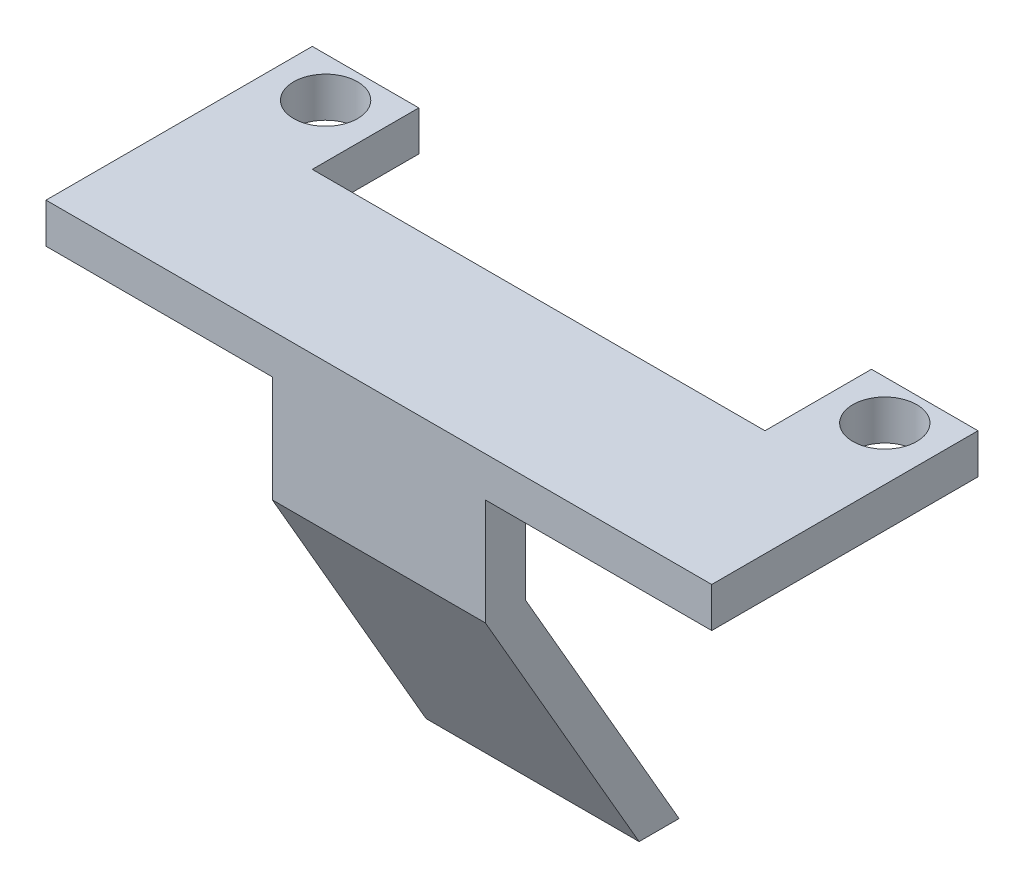
ISO-10303-21;
HEADER;
FILE_DESCRIPTION(('STEP AP214'),'2;1');
FILE_NAME('part.step','',(''),(''),'','','');
FILE_SCHEMA(('AUTOMOTIVE_DESIGN { 1 0 10303 214 1 1 1 1 }'));
ENDSEC;
DATA;
#1=APPLICATION_CONTEXT('core data for automotive mechanical design processes');
#2=APPLICATION_PROTOCOL_DEFINITION('international standard','automotive_design',2000,#1);
#3=PRODUCT_CONTEXT('',#1,'mechanical');
#4=PRODUCT('Part','Part','',(#3));
#5=PRODUCT_RELATED_PRODUCT_CATEGORY('part','',(#4));
#6=PRODUCT_DEFINITION_FORMATION('','',#4);
#7=PRODUCT_DEFINITION_CONTEXT('part definition',#1,'design');
#8=PRODUCT_DEFINITION('design','',#6,#7);
#9=PRODUCT_DEFINITION_SHAPE('','',#8);
#10=(LENGTH_UNIT() NAMED_UNIT(*) SI_UNIT(.MILLI.,.METRE.));
#11=(NAMED_UNIT(*) PLANE_ANGLE_UNIT() SI_UNIT($,.RADIAN.));
#12=(NAMED_UNIT(*) SI_UNIT($,.STERADIAN.) SOLID_ANGLE_UNIT());
#13=UNCERTAINTY_MEASURE_WITH_UNIT(LENGTH_MEASURE(1.E-05),#10,'distance_accuracy_value','');
#14=(GEOMETRIC_REPRESENTATION_CONTEXT(3) GLOBAL_UNCERTAINTY_ASSIGNED_CONTEXT((#13)) GLOBAL_UNIT_ASSIGNED_CONTEXT((#10,
#11,#12)) REPRESENTATION_CONTEXT('',''));
#15=CARTESIAN_POINT('',(0.,0.,0.));
#16=DIRECTION('',(0.,0.,1.));
#17=DIRECTION('',(1.,0.,0.));
#18=AXIS2_PLACEMENT_3D('',#15,#16,#17);
#19=CARTESIAN_POINT('',(0.,1.5,0.));
#20=DIRECTION('',(0.,-1.,0.));
#21=DIRECTION('',(0.,0.,-1.));
#22=AXIS2_PLACEMENT_3D('',#19,#20,#21);
#23=PLANE('',#22);
#24=DIRECTION('',(-1.,0.,0.));
#25=VECTOR('',#24,1.);
#26=CARTESIAN_POINT('',(-12.5,1.5,0.));
#27=LINE('',#26,#25);
#28=CARTESIAN_POINT('',(-8.5,1.5,0.));
#29=VERTEX_POINT('',#28);
#30=CARTESIAN_POINT('',(-12.5,1.5,0.));
#31=VERTEX_POINT('',#30);
#32=EDGE_CURVE('E227',#29,#31,#27,.T.);
#33=ORIENTED_EDGE('',*,*,#32,.T.);
#34=DIRECTION('',(0.,0.,1.));
#35=VECTOR('',#34,1.);
#36=CARTESIAN_POINT('',(-12.5,1.5,10.));
#37=LINE('',#36,#35);
#38=CARTESIAN_POINT('',(-12.5,1.5,10.));
#39=VERTEX_POINT('',#38);
#40=EDGE_CURVE('E231',#31,#39,#37,.T.);
#41=ORIENTED_EDGE('',*,*,#40,.T.);
#42=DIRECTION('',(1.,0.,0.));
#43=VECTOR('',#42,1.);
#44=CARTESIAN_POINT('',(12.5,1.5,10.));
#45=LINE('',#44,#43);
#46=CARTESIAN_POINT('',(12.5,1.5,10.));
#47=VERTEX_POINT('',#46);
#48=EDGE_CURVE('E235',#39,#47,#45,.T.);
#49=ORIENTED_EDGE('',*,*,#48,.T.);
#50=DIRECTION('',(0.,0.,-1.));
#51=VECTOR('',#50,1.);
#52=CARTESIAN_POINT('',(12.5,1.5,0.));
#53=LINE('',#52,#51);
#54=CARTESIAN_POINT('',(12.5,1.5,0.));
#55=VERTEX_POINT('',#54);
#56=EDGE_CURVE('E238',#47,#55,#53,.T.);
#57=ORIENTED_EDGE('',*,*,#56,.T.);
#58=DIRECTION('',(-1.,0.,0.));
#59=VECTOR('',#58,1.);
#60=CARTESIAN_POINT('',(8.5,1.5,0.));
#61=LINE('',#60,#59);
#62=CARTESIAN_POINT('',(8.5,1.5,0.));
#63=VERTEX_POINT('',#62);
#64=EDGE_CURVE('E241',#55,#63,#61,.T.);
#65=ORIENTED_EDGE('',*,*,#64,.T.);
#66=DIRECTION('',(0.,0.,1.));
#67=VECTOR('',#66,1.);
#68=CARTESIAN_POINT('',(8.5,1.5,4.));
#69=LINE('',#68,#67);
#70=CARTESIAN_POINT('',(8.5,1.5,4.));
#71=VERTEX_POINT('',#70);
#72=EDGE_CURVE('E244',#63,#71,#69,.T.);
#73=ORIENTED_EDGE('',*,*,#72,.T.);
#74=DIRECTION('',(-1.,0.,0.));
#75=VECTOR('',#74,1.);
#76=CARTESIAN_POINT('',(-8.5,1.5,4.));
#77=LINE('',#76,#75);
#78=CARTESIAN_POINT('',(-8.5,1.5,4.));
#79=VERTEX_POINT('',#78);
#80=EDGE_CURVE('E247',#71,#79,#77,.T.);
#81=ORIENTED_EDGE('',*,*,#80,.T.);
#82=DIRECTION('',(0.,0.,-1.));
#83=VECTOR('',#82,1.);
#84=CARTESIAN_POINT('',(-8.5,1.5,0.));
#85=LINE('',#84,#83);
#86=EDGE_CURVE('E250',#79,#29,#85,.T.);
#87=ORIENTED_EDGE('',*,*,#86,.T.);
#88=EDGE_LOOP('',(#33,#41,#49,#57,#65,#73,#81,#87));
#89=FACE_BOUND('',#88,.T.);
#90=CARTESIAN_POINT('',(-10.5,1.5,1.5));
#91=DIRECTION('',(0.,1.,0.));
#92=DIRECTION('',(0.,0.,1.));
#93=AXIS2_PLACEMENT_3D('',#90,#91,#92);
#94=CIRCLE('',#93,1.2);
#95=CARTESIAN_POINT('',(-10.5,1.5,2.7));
#96=VERTEX_POINT('',#95);
#97=EDGE_CURVE('E219',#96,#96,#94,.T.);
#98=ORIENTED_EDGE('',*,*,#97,.F.);
#99=EDGE_LOOP('',(#98));
#100=FACE_BOUND('',#99,.T.);
#101=CARTESIAN_POINT('',(10.5,1.5,1.5));
#102=DIRECTION('',(0.,1.,0.));
#103=DIRECTION('',(0.,0.,1.));
#104=AXIS2_PLACEMENT_3D('',#101,#102,#103);
#105=CIRCLE('',#104,1.2);
#106=CARTESIAN_POINT('',(10.5,1.5,2.7));
#107=VERTEX_POINT('',#106);
#108=EDGE_CURVE('E211',#107,#107,#105,.T.);
#109=ORIENTED_EDGE('',*,*,#108,.F.);
#110=EDGE_LOOP('',(#109));
#111=FACE_BOUND('',#110,.T.);
#112=ADVANCED_FACE('F39',(#89,#100,#111),#23,.F.);
#113=CARTESIAN_POINT('',(0.,0.,0.));
#114=DIRECTION('',(0.,-1.,0.));
#115=DIRECTION('',(0.,0.,-1.));
#116=AXIS2_PLACEMENT_3D('',#113,#114,#115);
#117=PLANE('',#116);
#118=DIRECTION('',(0.,0.,-1.));
#119=VECTOR('',#118,1.);
#120=CARTESIAN_POINT('',(-4.,0.,10.));
#121=LINE('',#120,#119);
#122=CARTESIAN_POINT('',(-4.,0.,10.));
#123=VERTEX_POINT('',#122);
#124=CARTESIAN_POINT('',(-4.,0.,8.50000000000001));
#125=VERTEX_POINT('',#124);
#126=EDGE_CURVE('E181',#123,#125,#121,.T.);
#127=ORIENTED_EDGE('',*,*,#126,.F.);
#128=DIRECTION('',(1.,0.,0.));
#129=VECTOR('',#128,1.);
#130=CARTESIAN_POINT('',(12.5,0.,10.));
#131=LINE('',#130,#129);
#132=CARTESIAN_POINT('',(-12.5,0.,10.));
#133=VERTEX_POINT('',#132);
#134=EDGE_CURVE('E260',#133,#123,#131,.T.);
#135=ORIENTED_EDGE('',*,*,#134,.F.);
#136=DIRECTION('',(0.,0.,1.));
#137=VECTOR('',#136,1.);
#138=CARTESIAN_POINT('',(-12.5,0.,10.));
#139=LINE('',#138,#137);
#140=CARTESIAN_POINT('',(-12.5,0.,0.));
#141=VERTEX_POINT('',#140);
#142=EDGE_CURVE('E257',#141,#133,#139,.T.);
#143=ORIENTED_EDGE('',*,*,#142,.F.);
#144=DIRECTION('',(-1.,0.,0.));
#145=VECTOR('',#144,1.);
#146=CARTESIAN_POINT('',(-12.5,0.,0.));
#147=LINE('',#146,#145);
#148=CARTESIAN_POINT('',(-8.5,0.,0.));
#149=VERTEX_POINT('',#148);
#150=EDGE_CURVE('E223',#149,#141,#147,.T.);
#151=ORIENTED_EDGE('',*,*,#150,.F.);
#152=DIRECTION('',(0.,0.,-1.));
#153=VECTOR('',#152,1.);
#154=CARTESIAN_POINT('',(-8.5,0.,0.));
#155=LINE('',#154,#153);
#156=CARTESIAN_POINT('',(-8.5,0.,4.));
#157=VERTEX_POINT('',#156);
#158=EDGE_CURVE('E232',#157,#149,#155,.T.);
#159=ORIENTED_EDGE('',*,*,#158,.F.);
#160=DIRECTION('',(-1.,0.,0.));
#161=VECTOR('',#160,1.);
#162=CARTESIAN_POINT('',(-8.5,0.,4.));
#163=LINE('',#162,#161);
#164=CARTESIAN_POINT('',(8.5,0.,4.));
#165=VERTEX_POINT('',#164);
#166=EDGE_CURVE('E273',#165,#157,#163,.T.);
#167=ORIENTED_EDGE('',*,*,#166,.F.);
#168=DIRECTION('',(0.,0.,1.));
#169=VECTOR('',#168,1.);
#170=CARTESIAN_POINT('',(8.5,0.,4.));
#171=LINE('',#170,#169);
#172=CARTESIAN_POINT('',(8.5,0.,0.));
#173=VERTEX_POINT('',#172);
#174=EDGE_CURVE('E270',#173,#165,#171,.T.);
#175=ORIENTED_EDGE('',*,*,#174,.F.);
#176=DIRECTION('',(-1.,0.,0.));
#177=VECTOR('',#176,1.);
#178=CARTESIAN_POINT('',(8.5,0.,0.));
#179=LINE('',#178,#177);
#180=CARTESIAN_POINT('',(12.5,0.,0.));
#181=VERTEX_POINT('',#180);
#182=EDGE_CURVE('E267',#181,#173,#179,.T.);
#183=ORIENTED_EDGE('',*,*,#182,.F.);
#184=DIRECTION('',(0.,0.,-1.));
#185=VECTOR('',#184,1.);
#186=CARTESIAN_POINT('',(12.5,0.,0.));
#187=LINE('',#186,#185);
#188=CARTESIAN_POINT('',(12.5,0.,10.));
#189=VERTEX_POINT('',#188);
#190=EDGE_CURVE('E264',#189,#181,#187,.T.);
#191=ORIENTED_EDGE('',*,*,#190,.F.);
#192=CARTESIAN_POINT('',(4.,0.,10.));
#193=VERTEX_POINT('',#192);
#194=EDGE_CURVE('E61',#193,#189,#131,.T.);
#195=ORIENTED_EDGE('',*,*,#194,.F.);
#196=DIRECTION('',(0.,0.,1.));
#197=VECTOR('',#196,1.);
#198=CARTESIAN_POINT('',(4.,0.,10.));
#199=LINE('',#198,#197);
#200=CARTESIAN_POINT('',(4.,0.,8.50000000000001));
#201=VERTEX_POINT('',#200);
#202=EDGE_CURVE('E186',#201,#193,#199,.T.);
#203=ORIENTED_EDGE('',*,*,#202,.F.);
#204=DIRECTION('',(1.,0.,0.));
#205=VECTOR('',#204,1.);
#206=CARTESIAN_POINT('',(-4.,0.,8.50000000000001));
#207=LINE('',#206,#205);
#208=EDGE_CURVE('E55',#125,#201,#207,.T.);
#209=ORIENTED_EDGE('',*,*,#208,.F.);
#210=EDGE_LOOP('',(#127,#135,#143,#151,#159,#167,#175,#183,#191,#195,#203,#209));
#211=FACE_BOUND('',#210,.T.);
#212=CARTESIAN_POINT('',(-10.5,0.,1.5));
#213=DIRECTION('',(0.,1.,0.));
#214=DIRECTION('',(0.,0.,1.));
#215=AXIS2_PLACEMENT_3D('',#212,#213,#214);
#216=CIRCLE('',#215,1.2);
#217=CARTESIAN_POINT('',(-10.5,0.,2.7));
#218=VERTEX_POINT('',#217);
#219=EDGE_CURVE('E215',#218,#218,#216,.T.);
#220=ORIENTED_EDGE('',*,*,#219,.T.);
#221=EDGE_LOOP('',(#220));
#222=FACE_BOUND('',#221,.T.);
#223=CARTESIAN_POINT('',(10.5,0.,1.5));
#224=DIRECTION('',(0.,1.,0.));
#225=DIRECTION('',(0.,0.,1.));
#226=AXIS2_PLACEMENT_3D('',#223,#224,#225);
#227=CIRCLE('',#226,1.2);
#228=CARTESIAN_POINT('',(10.5,0.,2.7));
#229=VERTEX_POINT('',#228);
#230=EDGE_CURVE('E210',#229,#229,#227,.T.);
#231=ORIENTED_EDGE('',*,*,#230,.T.);
#232=EDGE_LOOP('',(#231));
#233=FACE_BOUND('',#232,.T.);
#234=ADVANCED_FACE('F309',(#211,#222,#233),#117,.T.);
#235=CARTESIAN_POINT('',(-12.5,1.5,0.));
#236=DIRECTION('',(0.,0.,1.));
#237=DIRECTION('',(1.,0.,0.));
#238=AXIS2_PLACEMENT_3D('',#235,#236,#237);
#239=PLANE('',#238);
#240=ORIENTED_EDGE('',*,*,#150,.T.);
#241=DIRECTION('',(0.,-1.,0.));
#242=VECTOR('',#241,1.);
#243=CARTESIAN_POINT('',(-12.5,1.5,0.));
#244=LINE('',#243,#242);
#245=EDGE_CURVE('E11',#31,#141,#244,.T.);
#246=ORIENTED_EDGE('',*,*,#245,.F.);
#247=ORIENTED_EDGE('',*,*,#32,.F.);
#248=DIRECTION('',(0.,-1.,0.));
#249=VECTOR('',#248,1.);
#250=CARTESIAN_POINT('',(-8.5,1.5,0.));
#251=LINE('',#250,#249);
#252=EDGE_CURVE('E253',#29,#149,#251,.T.);
#253=ORIENTED_EDGE('',*,*,#252,.T.);
#254=EDGE_LOOP('',(#240,#246,#247,#253));
#255=FACE_BOUND('',#254,.T.);
#256=ADVANCED_FACE('F41',(#255),#239,.F.);
#257=CARTESIAN_POINT('',(-12.5,1.5,10.));
#258=DIRECTION('',(1.,0.,0.));
#259=DIRECTION('',(0.,0.,-1.));
#260=AXIS2_PLACEMENT_3D('',#257,#258,#259);
#261=PLANE('',#260);
#262=ORIENTED_EDGE('',*,*,#142,.T.);
#263=DIRECTION('',(0.,-1.,0.));
#264=VECTOR('',#263,1.);
#265=CARTESIAN_POINT('',(-12.5,1.5,10.));
#266=LINE('',#265,#264);
#267=EDGE_CURVE('E48',#39,#133,#266,.T.);
#268=ORIENTED_EDGE('',*,*,#267,.F.);
#269=ORIENTED_EDGE('',*,*,#40,.F.);
#270=ORIENTED_EDGE('',*,*,#245,.T.);
#271=EDGE_LOOP('',(#262,#268,#269,#270));
#272=FACE_BOUND('',#271,.T.);
#273=ADVANCED_FACE('F364',(#272),#261,.F.);
#274=CARTESIAN_POINT('',(12.5,1.5,10.));
#275=DIRECTION('',(0.,0.,-1.));
#276=DIRECTION('',(-1.,0.,0.));
#277=AXIS2_PLACEMENT_3D('',#274,#275,#276);
#278=PLANE('',#277);
#279=ORIENTED_EDGE('',*,*,#134,.T.);
#280=DIRECTION('',(0.,1.,0.));
#281=VECTOR('',#280,1.);
#282=CARTESIAN_POINT('',(-4.,-4.,10.));
#283=LINE('',#282,#281);
#284=CARTESIAN_POINT('',(-4.,-4.,10.));
#285=VERTEX_POINT('',#284);
#286=EDGE_CURVE('E190',#285,#123,#283,.T.);
#287=ORIENTED_EDGE('',*,*,#286,.F.);
#288=DIRECTION('',(-1.,0.,0.));
#289=VECTOR('',#288,1.);
#290=CARTESIAN_POINT('',(-4.,-4.,10.));
#291=LINE('',#290,#289);
#292=CARTESIAN_POINT('',(4.,-4.,10.));
#293=VERTEX_POINT('',#292);
#294=EDGE_CURVE('E185',#293,#285,#291,.T.);
#295=ORIENTED_EDGE('',*,*,#294,.F.);
#296=DIRECTION('',(0.,1.,0.));
#297=VECTOR('',#296,1.);
#298=CARTESIAN_POINT('',(4.,-4.,10.));
#299=LINE('',#298,#297);
#300=EDGE_CURVE('E200',#293,#193,#299,.T.);
#301=ORIENTED_EDGE('',*,*,#300,.T.);
#302=ORIENTED_EDGE('',*,*,#194,.T.);
#303=DIRECTION('',(0.,-1.,0.));
#304=VECTOR('',#303,1.);
#305=CARTESIAN_POINT('',(12.5,1.5,10.));
#306=LINE('',#305,#304);
#307=EDGE_CURVE('E297',#47,#189,#306,.T.);
#308=ORIENTED_EDGE('',*,*,#307,.F.);
#309=ORIENTED_EDGE('',*,*,#48,.F.);
#310=ORIENTED_EDGE('',*,*,#267,.T.);
#311=EDGE_LOOP('',(#279,#287,#295,#301,#302,#308,#309,#310));
#312=FACE_BOUND('',#311,.T.);
#313=ADVANCED_FACE('F306',(#312),#278,.F.);
#314=CARTESIAN_POINT('',(12.5,1.5,0.));
#315=DIRECTION('',(-1.,0.,0.));
#316=DIRECTION('',(0.,0.,1.));
#317=AXIS2_PLACEMENT_3D('',#314,#315,#316);
#318=PLANE('',#317);
#319=ORIENTED_EDGE('',*,*,#190,.T.);
#320=DIRECTION('',(0.,-1.,0.));
#321=VECTOR('',#320,1.);
#322=CARTESIAN_POINT('',(12.5,1.5,0.));
#323=LINE('',#322,#321);
#324=EDGE_CURVE('E293',#55,#181,#323,.T.);
#325=ORIENTED_EDGE('',*,*,#324,.F.);
#326=ORIENTED_EDGE('',*,*,#56,.F.);
#327=ORIENTED_EDGE('',*,*,#307,.T.);
#328=EDGE_LOOP('',(#319,#325,#326,#327));
#329=FACE_BOUND('',#328,.T.);
#330=ADVANCED_FACE('F358',(#329),#318,.F.);
#331=CARTESIAN_POINT('',(8.5,1.5,0.));
#332=DIRECTION('',(0.,0.,1.));
#333=DIRECTION('',(1.,0.,0.));
#334=AXIS2_PLACEMENT_3D('',#331,#332,#333);
#335=PLANE('',#334);
#336=ORIENTED_EDGE('',*,*,#182,.T.);
#337=DIRECTION('',(0.,-1.,0.));
#338=VECTOR('',#337,1.);
#339=CARTESIAN_POINT('',(8.5,1.5,0.));
#340=LINE('',#339,#338);
#341=EDGE_CURVE('E289',#63,#173,#340,.T.);
#342=ORIENTED_EDGE('',*,*,#341,.F.);
#343=ORIENTED_EDGE('',*,*,#64,.F.);
#344=ORIENTED_EDGE('',*,*,#324,.T.);
#345=EDGE_LOOP('',(#336,#342,#343,#344));
#346=FACE_BOUND('',#345,.T.);
#347=ADVANCED_FACE('F354',(#346),#335,.F.);
#348=CARTESIAN_POINT('',(8.5,1.5,4.));
#349=DIRECTION('',(1.,0.,0.));
#350=DIRECTION('',(0.,0.,-1.));
#351=AXIS2_PLACEMENT_3D('',#348,#349,#350);
#352=PLANE('',#351);
#353=ORIENTED_EDGE('',*,*,#174,.T.);
#354=DIRECTION('',(0.,-1.,0.));
#355=VECTOR('',#354,1.);
#356=CARTESIAN_POINT('',(8.5,1.5,4.));
#357=LINE('',#356,#355);
#358=EDGE_CURVE('E285',#71,#165,#357,.T.);
#359=ORIENTED_EDGE('',*,*,#358,.F.);
#360=ORIENTED_EDGE('',*,*,#72,.F.);
#361=ORIENTED_EDGE('',*,*,#341,.T.);
#362=EDGE_LOOP('',(#353,#359,#360,#361));
#363=FACE_BOUND('',#362,.T.);
#364=ADVANCED_FACE('F350',(#363),#352,.F.);
#365=CARTESIAN_POINT('',(-8.5,1.5,4.));
#366=DIRECTION('',(0.,0.,1.));
#367=DIRECTION('',(1.,0.,0.));
#368=AXIS2_PLACEMENT_3D('',#365,#366,#367);
#369=PLANE('',#368);
#370=ORIENTED_EDGE('',*,*,#166,.T.);
#371=DIRECTION('',(0.,-1.,0.));
#372=VECTOR('',#371,1.);
#373=CARTESIAN_POINT('',(-8.5,1.5,4.));
#374=LINE('',#373,#372);
#375=EDGE_CURVE('E281',#79,#157,#374,.T.);
#376=ORIENTED_EDGE('',*,*,#375,.F.);
#377=ORIENTED_EDGE('',*,*,#80,.F.);
#378=ORIENTED_EDGE('',*,*,#358,.T.);
#379=EDGE_LOOP('',(#370,#376,#377,#378));
#380=FACE_BOUND('',#379,.T.);
#381=ADVANCED_FACE('F346',(#380),#369,.F.);
#382=CARTESIAN_POINT('',(-8.5,1.5,0.));
#383=DIRECTION('',(-1.,0.,0.));
#384=DIRECTION('',(0.,0.,1.));
#385=AXIS2_PLACEMENT_3D('',#382,#383,#384);
#386=PLANE('',#385);
#387=ORIENTED_EDGE('',*,*,#158,.T.);
#388=ORIENTED_EDGE('',*,*,#252,.F.);
#389=ORIENTED_EDGE('',*,*,#86,.F.);
#390=ORIENTED_EDGE('',*,*,#375,.T.);
#391=EDGE_LOOP('',(#387,#388,#389,#390));
#392=FACE_BOUND('',#391,.T.);
#393=ADVANCED_FACE('F343',(#392),#386,.F.);
#394=CARTESIAN_POINT('',(-10.5,1.5,1.5));
#395=DIRECTION('',(0.,-1.,0.));
#396=DIRECTION('',(0.,0.,-1.));
#397=AXIS2_PLACEMENT_3D('',#394,#395,#396);
#398=CYLINDRICAL_SURFACE('',#397,1.2);
#399=ORIENTED_EDGE('',*,*,#97,.T.);
#400=EDGE_LOOP('',(#399));
#401=FACE_BOUND('',#400,.T.);
#402=ORIENTED_EDGE('',*,*,#219,.F.);
#403=EDGE_LOOP('',(#402));
#404=FACE_BOUND('',#403,.T.);
#405=ADVANCED_FACE('F340',(#401,#404),#398,.F.);
#406=CARTESIAN_POINT('',(10.5,1.5,1.5));
#407=DIRECTION('',(0.,-1.,0.));
#408=DIRECTION('',(0.,0.,-1.));
#409=AXIS2_PLACEMENT_3D('',#406,#407,#408);
#410=CYLINDRICAL_SURFACE('',#409,1.2);
#411=ORIENTED_EDGE('',*,*,#108,.T.);
#412=EDGE_LOOP('',(#411));
#413=FACE_BOUND('',#412,.T.);
#414=ORIENTED_EDGE('',*,*,#230,.F.);
#415=EDGE_LOOP('',(#414));
#416=FACE_BOUND('',#415,.T.);
#417=ADVANCED_FACE('F329',(#413,#416),#410,.F.);
#418=CARTESIAN_POINT('',(-4.,-4.,10.));
#419=DIRECTION('',(1.,0.,0.));
#420=DIRECTION('',(0.,0.,-1.));
#421=AXIS2_PLACEMENT_3D('',#418,#419,#420);
#422=PLANE('',#421);
#423=ORIENTED_EDGE('',*,*,#126,.T.);
#424=DIRECTION('',(0.,1.,0.));
#425=VECTOR('',#424,1.);
#426=CARTESIAN_POINT('',(-4.,-4.,8.50000000000001));
#427=LINE('',#426,#425);
#428=CARTESIAN_POINT('',(-4.,-4.,8.50000000000001));
#429=VERTEX_POINT('',#428);
#430=EDGE_CURVE('E167',#429,#125,#427,.T.);
#431=ORIENTED_EDGE('',*,*,#430,.F.);
#432=DIRECTION('',(0.,-0.866025403784442,-0.499999999999995));
#433=VECTOR('',#432,1.);
#434=CARTESIAN_POINT('',(-4.,-14.,2.72649730810383));
#435=LINE('',#434,#433);
#436=CARTESIAN_POINT('',(-4.,-14.,2.72649730810383));
#437=VERTEX_POINT('',#436);
#438=EDGE_CURVE('E146',#429,#437,#435,.T.);
#439=ORIENTED_EDGE('',*,*,#438,.T.);
#440=DIRECTION('',(0.,0.,1.));
#441=VECTOR('',#440,1.);
#442=CARTESIAN_POINT('',(-4.,-14.,4.22649730810383));
#443=LINE('',#442,#441);
#444=CARTESIAN_POINT('',(-4.,-14.,4.22649730810383));
#445=VERTEX_POINT('',#444);
#446=EDGE_CURVE('E156',#437,#445,#443,.T.);
#447=ORIENTED_EDGE('',*,*,#446,.T.);
#448=DIRECTION('',(0.,0.866025403784442,0.499999999999995));
#449=VECTOR('',#448,1.);
#450=CARTESIAN_POINT('',(-4.,-4.,10.));
#451=LINE('',#450,#449);
#452=EDGE_CURVE('E153',#445,#285,#451,.T.);
#453=ORIENTED_EDGE('',*,*,#452,.T.);
#454=ORIENTED_EDGE('',*,*,#286,.T.);
#455=EDGE_LOOP('',(#423,#431,#439,#447,#453,#454));
#456=FACE_BOUND('',#455,.T.);
#457=ADVANCED_FACE('F166',(#456),#422,.F.);
#458=CARTESIAN_POINT('',(-4.,-4.,8.50000000000001));
#459=DIRECTION('',(0.,0.,1.));
#460=DIRECTION('',(1.,0.,0.));
#461=AXIS2_PLACEMENT_3D('',#458,#459,#460);
#462=PLANE('',#461);
#463=ORIENTED_EDGE('',*,*,#208,.T.);
#464=DIRECTION('',(0.,1.,0.));
#465=VECTOR('',#464,1.);
#466=CARTESIAN_POINT('',(4.,-4.,8.50000000000001));
#467=LINE('',#466,#465);
#468=CARTESIAN_POINT('',(4.,-4.,8.50000000000001));
#469=VERTEX_POINT('',#468);
#470=EDGE_CURVE('E204',#469,#201,#467,.T.);
#471=ORIENTED_EDGE('',*,*,#470,.F.);
#472=DIRECTION('',(1.,0.,0.));
#473=VECTOR('',#472,1.);
#474=CARTESIAN_POINT('',(-4.,-4.,8.50000000000001));
#475=LINE('',#474,#473);
#476=EDGE_CURVE('E182',#429,#469,#475,.T.);
#477=ORIENTED_EDGE('',*,*,#476,.F.);
#478=ORIENTED_EDGE('',*,*,#430,.T.);
#479=EDGE_LOOP('',(#463,#471,#477,#478));
#480=FACE_BOUND('',#479,.T.);
#481=ADVANCED_FACE('F321',(#480),#462,.F.);
#482=CARTESIAN_POINT('',(4.,-4.,10.));
#483=DIRECTION('',(-1.,0.,0.));
#484=DIRECTION('',(0.,0.,1.));
#485=AXIS2_PLACEMENT_3D('',#482,#483,#484);
#486=PLANE('',#485);
#487=ORIENTED_EDGE('',*,*,#202,.T.);
#488=ORIENTED_EDGE('',*,*,#300,.F.);
#489=DIRECTION('',(0.,-0.866025403784442,-0.499999999999995));
#490=VECTOR('',#489,1.);
#491=CARTESIAN_POINT('',(4.,-4.,10.));
#492=LINE('',#491,#490);
#493=CARTESIAN_POINT('',(4.,-14.,4.22649730810383));
#494=VERTEX_POINT('',#493);
#495=EDGE_CURVE('E171',#293,#494,#492,.T.);
#496=ORIENTED_EDGE('',*,*,#495,.T.);
#497=DIRECTION('',(0.,0.,-1.));
#498=VECTOR('',#497,1.);
#499=CARTESIAN_POINT('',(4.,-14.,4.22649730810383));
#500=LINE('',#499,#498);
#501=CARTESIAN_POINT('',(4.,-14.,2.72649730810383));
#502=VERTEX_POINT('',#501);
#503=EDGE_CURVE('E177',#494,#502,#500,.T.);
#504=ORIENTED_EDGE('',*,*,#503,.T.);
#505=DIRECTION('',(0.,0.866025403784442,0.499999999999995));
#506=VECTOR('',#505,1.);
#507=CARTESIAN_POINT('',(4.,-14.,2.72649730810383));
#508=LINE('',#507,#506);
#509=EDGE_CURVE('E148',#502,#469,#508,.T.);
#510=ORIENTED_EDGE('',*,*,#509,.T.);
#511=ORIENTED_EDGE('',*,*,#470,.T.);
#512=EDGE_LOOP('',(#487,#488,#496,#504,#510,#511));
#513=FACE_BOUND('',#512,.T.);
#514=ADVANCED_FACE('F319',(#513),#486,.F.);
#515=CARTESIAN_POINT('',(16.3654292852703,-4.,10.));
#516=DIRECTION('',(0.,-0.499999999999995,0.866025403784442));
#517=DIRECTION('',(0.,-0.866025403784442,-0.499999999999995));
#518=AXIS2_PLACEMENT_3D('',#515,#516,#517);
#519=PLANE('',#518);
#520=ORIENTED_EDGE('',*,*,#495,.F.);
#521=ORIENTED_EDGE('',*,*,#294,.T.);
#522=ORIENTED_EDGE('',*,*,#452,.F.);
#523=DIRECTION('',(-1.,0.,0.));
#524=VECTOR('',#523,1.);
#525=CARTESIAN_POINT('',(16.3654292852703,-14.,4.22649730810383));
#526=LINE('',#525,#524);
#527=EDGE_CURVE('E152',#494,#445,#526,.T.);
#528=ORIENTED_EDGE('',*,*,#527,.F.);
#529=EDGE_LOOP('',(#520,#521,#522,#528));
#530=FACE_BOUND('',#529,.T.);
#531=ADVANCED_FACE('F315',(#530),#519,.T.);
#532=CARTESIAN_POINT('',(16.3654292852703,-14.,4.22649730810383));
#533=DIRECTION('',(0.,-1.,0.));
#534=DIRECTION('',(0.,0.,-1.));
#535=AXIS2_PLACEMENT_3D('',#532,#533,#534);
#536=PLANE('',#535);
#537=ORIENTED_EDGE('',*,*,#503,.F.);
#538=ORIENTED_EDGE('',*,*,#527,.T.);
#539=ORIENTED_EDGE('',*,*,#446,.F.);
#540=DIRECTION('',(-1.,0.,0.));
#541=VECTOR('',#540,1.);
#542=CARTESIAN_POINT('',(16.3654292852703,-14.,2.72649730810383));
#543=LINE('',#542,#541);
#544=EDGE_CURVE('E141',#502,#437,#543,.T.);
#545=ORIENTED_EDGE('',*,*,#544,.F.);
#546=EDGE_LOOP('',(#537,#538,#539,#545));
#547=FACE_BOUND('',#546,.T.);
#548=ADVANCED_FACE('F157',(#547),#536,.T.);
#549=CARTESIAN_POINT('',(16.3654292852703,-14.,2.72649730810383));
#550=DIRECTION('',(0.,0.499999999999995,-0.866025403784442));
#551=DIRECTION('',(0.,0.866025403784442,0.499999999999995));
#552=AXIS2_PLACEMENT_3D('',#549,#550,#551);
#553=PLANE('',#552);
#554=ORIENTED_EDGE('',*,*,#509,.F.);
#555=ORIENTED_EDGE('',*,*,#544,.T.);
#556=ORIENTED_EDGE('',*,*,#438,.F.);
#557=ORIENTED_EDGE('',*,*,#476,.T.);
#558=EDGE_LOOP('',(#554,#555,#556,#557));
#559=FACE_BOUND('',#558,.T.);
#560=ADVANCED_FACE('F143',(#559),#553,.T.);
#561=CLOSED_SHELL('',(#112,#234,#256,#273,#313,#330,#347,#364,#381,#393,#405,#417,#457,#481,
#514,#531,#548,#560));
#562=MANIFOLD_SOLID_BREP('B2',#561);
#563=ADVANCED_BREP_SHAPE_REPRESENTATION('',(#18,#562),#14);
#564=SHAPE_DEFINITION_REPRESENTATION(#9,#563);
ENDSEC;
END-ISO-10303-21;
